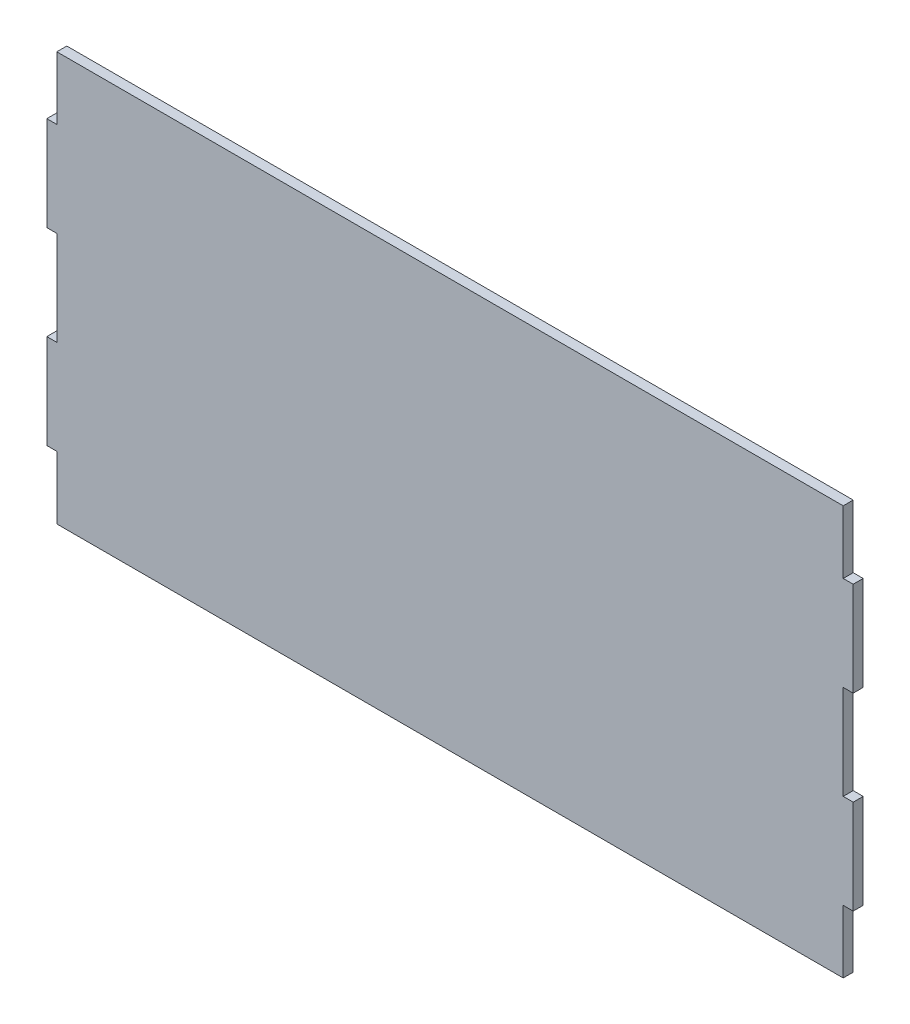
ISO-10303-21;
HEADER;
FILE_DESCRIPTION(('STEP AP214'),'2;1');
FILE_NAME('part.step','',(''),(''),'','','');
FILE_SCHEMA(('AUTOMOTIVE_DESIGN { 1 0 10303 214 1 1 1 1 }'));
ENDSEC;
DATA;
#1=APPLICATION_CONTEXT('core data for automotive mechanical design processes');
#2=APPLICATION_PROTOCOL_DEFINITION('international standard','automotive_design',2000,#1);
#3=PRODUCT_CONTEXT('',#1,'mechanical');
#4=PRODUCT('Part','Part','',(#3));
#5=PRODUCT_RELATED_PRODUCT_CATEGORY('part','',(#4));
#6=PRODUCT_DEFINITION_FORMATION('','',#4);
#7=PRODUCT_DEFINITION_CONTEXT('part definition',#1,'design');
#8=PRODUCT_DEFINITION('design','',#6,#7);
#9=PRODUCT_DEFINITION_SHAPE('','',#8);
#10=(LENGTH_UNIT() NAMED_UNIT(*) SI_UNIT(.MILLI.,.METRE.));
#11=(NAMED_UNIT(*) PLANE_ANGLE_UNIT() SI_UNIT($,.RADIAN.));
#12=(NAMED_UNIT(*) SI_UNIT($,.STERADIAN.) SOLID_ANGLE_UNIT());
#13=UNCERTAINTY_MEASURE_WITH_UNIT(LENGTH_MEASURE(1.E-05),#10,'distance_accuracy_value','');
#14=(GEOMETRIC_REPRESENTATION_CONTEXT(3) GLOBAL_UNCERTAINTY_ASSIGNED_CONTEXT((#13)) GLOBAL_UNIT_ASSIGNED_CONTEXT((#10,
#11,#12)) REPRESENTATION_CONTEXT('',''));
#15=CARTESIAN_POINT('',(0.,0.,0.));
#16=DIRECTION('',(0.,0.,1.));
#17=DIRECTION('',(1.,0.,0.));
#18=AXIS2_PLACEMENT_3D('',#15,#16,#17);
#19=CARTESIAN_POINT('',(250.,0.,3.175));
#20=DIRECTION('',(-1.,0.,0.));
#21=DIRECTION('',(0.,-1.,0.));
#22=AXIS2_PLACEMENT_3D('',#19,#20,#21);
#23=PLANE('',#22);
#24=DIRECTION('',(0.,1.,0.));
#25=VECTOR('',#24,1.);
#26=CARTESIAN_POINT('',(250.,0.,3.175));
#27=LINE('',#26,#25);
#28=CARTESIAN_POINT('',(250.,-80.,3.175));
#29=VERTEX_POINT('',#28);
#30=CARTESIAN_POINT('',(250.,-50.,3.175));
#31=VERTEX_POINT('',#30);
#32=EDGE_CURVE('E36',#29,#31,#27,.T.);
#33=ORIENTED_EDGE('',*,*,#32,.F.);
#34=DIRECTION('',(0.,0.,1.));
#35=VECTOR('',#34,1.);
#36=CARTESIAN_POINT('',(250.,-80.,-30.1675425747607));
#37=LINE('',#36,#35);
#38=CARTESIAN_POINT('',(250.,-80.,0.));
#39=VERTEX_POINT('',#38);
#40=EDGE_CURVE('E203',#39,#29,#37,.T.);
#41=ORIENTED_EDGE('',*,*,#40,.F.);
#42=DIRECTION('',(0.,1.,0.));
#43=VECTOR('',#42,1.);
#44=CARTESIAN_POINT('',(250.,0.,0.));
#45=LINE('',#44,#43);
#46=CARTESIAN_POINT('',(250.,-50.,0.));
#47=VERTEX_POINT('',#46);
#48=EDGE_CURVE('E335',#39,#47,#45,.T.);
#49=ORIENTED_EDGE('',*,*,#48,.T.);
#50=DIRECTION('',(0.,0.,1.));
#51=VECTOR('',#50,1.);
#52=CARTESIAN_POINT('',(250.,-50.,-30.1675425747607));
#53=LINE('',#52,#51);
#54=EDGE_CURVE('E255',#47,#31,#53,.T.);
#55=ORIENTED_EDGE('',*,*,#54,.T.);
#56=EDGE_LOOP('',(#33,#41,#49,#55));
#57=FACE_BOUND('',#56,.T.);
#58=ADVANCED_FACE('F32',(#57),#23,.F.);
#59=CARTESIAN_POINT('',(0.,0.,3.175));
#60=DIRECTION('',(1.,0.,0.));
#61=DIRECTION('',(0.,1.,0.));
#62=AXIS2_PLACEMENT_3D('',#59,#60,#61);
#63=PLANE('',#62);
#64=DIRECTION('',(0.,-1.,0.));
#65=VECTOR('',#64,1.);
#66=CARTESIAN_POINT('',(0.,0.,3.175));
#67=LINE('',#66,#65);
#68=CARTESIAN_POINT('',(0.,-110.,3.175));
#69=VERTEX_POINT('',#68);
#70=CARTESIAN_POINT('',(0.,-130.,3.175));
#71=VERTEX_POINT('',#70);
#72=EDGE_CURVE('E333',#69,#71,#67,.T.);
#73=ORIENTED_EDGE('',*,*,#72,.F.);
#74=DIRECTION('',(0.,0.,1.));
#75=VECTOR('',#74,1.);
#76=CARTESIAN_POINT('',(0.,-110.,-30.1675425747607));
#77=LINE('',#76,#75);
#78=CARTESIAN_POINT('',(0.,-110.,0.));
#79=VERTEX_POINT('',#78);
#80=EDGE_CURVE('E213',#79,#69,#77,.T.);
#81=ORIENTED_EDGE('',*,*,#80,.F.);
#82=DIRECTION('',(0.,-1.,0.));
#83=VECTOR('',#82,1.);
#84=CARTESIAN_POINT('',(0.,0.,0.));
#85=LINE('',#84,#83);
#86=CARTESIAN_POINT('',(0.,-130.,0.));
#87=VERTEX_POINT('',#86);
#88=EDGE_CURVE('E303',#79,#87,#85,.T.);
#89=ORIENTED_EDGE('',*,*,#88,.T.);
#90=DIRECTION('',(0.,0.,-1.));
#91=VECTOR('',#90,1.);
#92=CARTESIAN_POINT('',(0.,-130.,3.175));
#93=LINE('',#92,#91);
#94=EDGE_CURVE('E11',#71,#87,#93,.T.);
#95=ORIENTED_EDGE('',*,*,#94,.F.);
#96=EDGE_LOOP('',(#73,#81,#89,#95));
#97=FACE_BOUND('',#96,.T.);
#98=ADVANCED_FACE('F402',(#97),#63,.F.);
#99=DIRECTION('',(0.,0.,1.));
#100=VECTOR('',#99,1.);
#101=CARTESIAN_POINT('',(250.,-20.,-30.1675425747607));
#102=LINE('',#101,#100);
#103=CARTESIAN_POINT('',(250.,-20.,0.));
#104=VERTEX_POINT('',#103);
#105=CARTESIAN_POINT('',(250.,-20.,3.175));
#106=VERTEX_POINT('',#105);
#107=EDGE_CURVE('E238',#104,#106,#102,.T.);
#108=ORIENTED_EDGE('',*,*,#107,.F.);
#109=CARTESIAN_POINT('',(250.,0.,0.));
#110=VERTEX_POINT('',#109);
#111=EDGE_CURVE('E337',#104,#110,#45,.T.);
#112=ORIENTED_EDGE('',*,*,#111,.T.);
#113=DIRECTION('',(0.,0.,-1.));
#114=VECTOR('',#113,1.);
#115=CARTESIAN_POINT('',(250.,0.,3.175));
#116=LINE('',#115,#114);
#117=CARTESIAN_POINT('',(250.,0.,3.175));
#118=VERTEX_POINT('',#117);
#119=EDGE_CURVE('E358',#118,#110,#116,.T.);
#120=ORIENTED_EDGE('',*,*,#119,.F.);
#121=EDGE_CURVE('E251',#106,#118,#27,.T.);
#122=ORIENTED_EDGE('',*,*,#121,.F.);
#123=EDGE_LOOP('',(#108,#112,#120,#122));
#124=FACE_BOUND('',#123,.T.);
#125=ADVANCED_FACE('F370',(#124),#23,.F.);
#126=CARTESIAN_POINT('',(0.,-50.,0.));
#127=VERTEX_POINT('',#126);
#128=CARTESIAN_POINT('',(0.,-80.,0.));
#129=VERTEX_POINT('',#128);
#130=EDGE_CURVE('E319',#127,#129,#85,.T.);
#131=ORIENTED_EDGE('',*,*,#130,.T.);
#132=DIRECTION('',(0.,0.,1.));
#133=VECTOR('',#132,1.);
#134=CARTESIAN_POINT('',(0.,-80.,-30.1675425747607));
#135=LINE('',#134,#133);
#136=CARTESIAN_POINT('',(0.,-80.,3.175));
#137=VERTEX_POINT('',#136);
#138=EDGE_CURVE('E224',#129,#137,#135,.T.);
#139=ORIENTED_EDGE('',*,*,#138,.T.);
#140=CARTESIAN_POINT('',(0.,-50.,3.175));
#141=VERTEX_POINT('',#140);
#142=EDGE_CURVE('E289',#141,#137,#67,.T.);
#143=ORIENTED_EDGE('',*,*,#142,.F.);
#144=DIRECTION('',(0.,0.,1.));
#145=VECTOR('',#144,1.);
#146=CARTESIAN_POINT('',(0.,-50.,-30.1675425747607));
#147=LINE('',#146,#145);
#148=EDGE_CURVE('E276',#127,#141,#147,.T.);
#149=ORIENTED_EDGE('',*,*,#148,.F.);
#150=EDGE_LOOP('',(#131,#139,#143,#149));
#151=FACE_BOUND('',#150,.T.);
#152=ADVANCED_FACE('F409',(#151),#63,.F.);
#153=CARTESIAN_POINT('',(0.,0.,0.));
#154=VERTEX_POINT('',#153);
#155=CARTESIAN_POINT('',(0.,-20.,0.));
#156=VERTEX_POINT('',#155);
#157=EDGE_CURVE('E322',#154,#156,#85,.T.);
#158=ORIENTED_EDGE('',*,*,#157,.T.);
#159=DIRECTION('',(0.,0.,1.));
#160=VECTOR('',#159,1.);
#161=CARTESIAN_POINT('',(0.,-20.,-30.1675425747607));
#162=LINE('',#161,#160);
#163=CARTESIAN_POINT('',(0.,-20.,3.175));
#164=VERTEX_POINT('',#163);
#165=EDGE_CURVE('E294',#156,#164,#162,.T.);
#166=ORIENTED_EDGE('',*,*,#165,.T.);
#167=CARTESIAN_POINT('',(0.,0.,3.175));
#168=VERTEX_POINT('',#167);
#169=EDGE_CURVE('E317',#168,#164,#67,.T.);
#170=ORIENTED_EDGE('',*,*,#169,.F.);
#171=DIRECTION('',(0.,0.,-1.));
#172=VECTOR('',#171,1.);
#173=CARTESIAN_POINT('',(0.,0.,3.175));
#174=LINE('',#173,#172);
#175=EDGE_CURVE('E355',#168,#154,#174,.T.);
#176=ORIENTED_EDGE('',*,*,#175,.T.);
#177=EDGE_LOOP('',(#158,#166,#170,#176));
#178=FACE_BOUND('',#177,.T.);
#179=ADVANCED_FACE('F34',(#178),#63,.F.);
#180=CARTESIAN_POINT('',(0.,-130.,3.175));
#181=DIRECTION('',(0.,1.,0.));
#182=DIRECTION('',(0.,0.,1.));
#183=AXIS2_PLACEMENT_3D('',#180,#181,#182);
#184=PLANE('',#183);
#185=DIRECTION('',(1.,0.,0.));
#186=VECTOR('',#185,1.);
#187=CARTESIAN_POINT('',(0.,-130.,0.));
#188=LINE('',#187,#186);
#189=CARTESIAN_POINT('',(250.,-130.,0.));
#190=VERTEX_POINT('',#189);
#191=EDGE_CURVE('E327',#87,#190,#188,.T.);
#192=ORIENTED_EDGE('',*,*,#191,.T.);
#193=DIRECTION('',(0.,0.,-1.));
#194=VECTOR('',#193,1.);
#195=CARTESIAN_POINT('',(250.,-130.,3.175));
#196=LINE('',#195,#194);
#197=CARTESIAN_POINT('',(250.,-130.,3.175));
#198=VERTEX_POINT('',#197);
#199=EDGE_CURVE('E42',#198,#190,#196,.T.);
#200=ORIENTED_EDGE('',*,*,#199,.F.);
#201=DIRECTION('',(1.,0.,0.));
#202=VECTOR('',#201,1.);
#203=CARTESIAN_POINT('',(0.,-130.,3.175));
#204=LINE('',#203,#202);
#205=EDGE_CURVE('E313',#71,#198,#204,.T.);
#206=ORIENTED_EDGE('',*,*,#205,.F.);
#207=ORIENTED_EDGE('',*,*,#94,.T.);
#208=EDGE_LOOP('',(#192,#200,#206,#207));
#209=FACE_BOUND('',#208,.T.);
#210=ADVANCED_FACE('F413',(#209),#184,.F.);
#211=CARTESIAN_POINT('',(250.,-110.,0.));
#212=VERTEX_POINT('',#211);
#213=EDGE_CURVE('E336',#190,#212,#45,.T.);
#214=ORIENTED_EDGE('',*,*,#213,.T.);
#215=DIRECTION('',(0.,0.,1.));
#216=VECTOR('',#215,1.);
#217=CARTESIAN_POINT('',(250.,-110.,-30.1675425747607));
#218=LINE('',#217,#216);
#219=CARTESIAN_POINT('',(250.,-110.,3.175));
#220=VERTEX_POINT('',#219);
#221=EDGE_CURVE('E57',#212,#220,#218,.T.);
#222=ORIENTED_EDGE('',*,*,#221,.T.);
#223=EDGE_CURVE('E196',#198,#220,#27,.T.);
#224=ORIENTED_EDGE('',*,*,#223,.F.);
#225=ORIENTED_EDGE('',*,*,#199,.T.);
#226=EDGE_LOOP('',(#214,#222,#224,#225));
#227=FACE_BOUND('',#226,.T.);
#228=ADVANCED_FACE('F404',(#227),#23,.F.);
#229=CARTESIAN_POINT('',(0.,0.,3.175));
#230=DIRECTION('',(0.,-1.,0.));
#231=DIRECTION('',(0.,0.,-1.));
#232=AXIS2_PLACEMENT_3D('',#229,#230,#231);
#233=PLANE('',#232);
#234=DIRECTION('',(-1.,0.,0.));
#235=VECTOR('',#234,1.);
#236=CARTESIAN_POINT('',(0.,0.,0.));
#237=LINE('',#236,#235);
#238=EDGE_CURVE('E334',#110,#154,#237,.T.);
#239=ORIENTED_EDGE('',*,*,#238,.T.);
#240=ORIENTED_EDGE('',*,*,#175,.F.);
#241=DIRECTION('',(-1.,0.,0.));
#242=VECTOR('',#241,1.);
#243=CARTESIAN_POINT('',(0.,0.,3.175));
#244=LINE('',#243,#242);
#245=EDGE_CURVE('E326',#118,#168,#244,.T.);
#246=ORIENTED_EDGE('',*,*,#245,.F.);
#247=ORIENTED_EDGE('',*,*,#119,.T.);
#248=EDGE_LOOP('',(#239,#240,#246,#247));
#249=FACE_BOUND('',#248,.T.);
#250=ADVANCED_FACE('F353',(#249),#233,.F.);
#251=CARTESIAN_POINT('',(0.,0.,3.175));
#252=DIRECTION('',(0.,0.,1.));
#253=DIRECTION('',(1.,0.,0.));
#254=AXIS2_PLACEMENT_3D('',#251,#252,#253);
#255=PLANE('',#254);
#256=ORIENTED_EDGE('',*,*,#169,.T.);
#257=DIRECTION('',(-1.,0.,0.));
#258=VECTOR('',#257,1.);
#259=CARTESIAN_POINT('',(0.,-20.,3.175));
#260=LINE('',#259,#258);
#261=CARTESIAN_POINT('',(-3.175,-20.,3.175));
#262=VERTEX_POINT('',#261);
#263=EDGE_CURVE('E264',#164,#262,#260,.T.);
#264=ORIENTED_EDGE('',*,*,#263,.T.);
#265=DIRECTION('',(0.,-1.,0.));
#266=VECTOR('',#265,1.);
#267=CARTESIAN_POINT('',(-3.175,-20.,3.175));
#268=LINE('',#267,#266);
#269=CARTESIAN_POINT('',(-3.175,-50.,3.175));
#270=VERTEX_POINT('',#269);
#271=EDGE_CURVE('E277',#262,#270,#268,.T.);
#272=ORIENTED_EDGE('',*,*,#271,.T.);
#273=DIRECTION('',(1.,0.,0.));
#274=VECTOR('',#273,1.);
#275=CARTESIAN_POINT('',(0.,-50.,3.175));
#276=LINE('',#275,#274);
#277=EDGE_CURVE('E280',#270,#141,#276,.T.);
#278=ORIENTED_EDGE('',*,*,#277,.T.);
#279=ORIENTED_EDGE('',*,*,#142,.T.);
#280=DIRECTION('',(-1.,0.,0.));
#281=VECTOR('',#280,1.);
#282=CARTESIAN_POINT('',(0.,-80.,3.175));
#283=LINE('',#282,#281);
#284=CARTESIAN_POINT('',(-3.17499999999999,-80.,3.175));
#285=VERTEX_POINT('',#284);
#286=EDGE_CURVE('E209',#137,#285,#283,.T.);
#287=ORIENTED_EDGE('',*,*,#286,.T.);
#288=DIRECTION('',(0.,-1.,0.));
#289=VECTOR('',#288,1.);
#290=CARTESIAN_POINT('',(-3.17499999999999,-80.,3.175));
#291=LINE('',#290,#289);
#292=CARTESIAN_POINT('',(-3.17499999999999,-110.,3.175));
#293=VERTEX_POINT('',#292);
#294=EDGE_CURVE('E218',#285,#293,#291,.T.);
#295=ORIENTED_EDGE('',*,*,#294,.T.);
#296=DIRECTION('',(1.,0.,0.));
#297=VECTOR('',#296,1.);
#298=CARTESIAN_POINT('',(0.,-110.,3.175));
#299=LINE('',#298,#297);
#300=EDGE_CURVE('E221',#293,#69,#299,.T.);
#301=ORIENTED_EDGE('',*,*,#300,.T.);
#302=ORIENTED_EDGE('',*,*,#72,.T.);
#303=ORIENTED_EDGE('',*,*,#205,.T.);
#304=ORIENTED_EDGE('',*,*,#223,.T.);
#305=DIRECTION('',(1.,0.,0.));
#306=VECTOR('',#305,1.);
#307=CARTESIAN_POINT('',(250.,-110.,3.175));
#308=LINE('',#307,#306);
#309=CARTESIAN_POINT('',(253.175,-110.,3.175));
#310=VERTEX_POINT('',#309);
#311=EDGE_CURVE('E178',#220,#310,#308,.T.);
#312=ORIENTED_EDGE('',*,*,#311,.T.);
#313=DIRECTION('',(0.,1.,0.));
#314=VECTOR('',#313,1.);
#315=CARTESIAN_POINT('',(253.175,-80.,3.175));
#316=LINE('',#315,#314);
#317=CARTESIAN_POINT('',(253.175,-80.,3.175));
#318=VERTEX_POINT('',#317);
#319=EDGE_CURVE('E186',#310,#318,#316,.T.);
#320=ORIENTED_EDGE('',*,*,#319,.T.);
#321=DIRECTION('',(-1.,0.,0.));
#322=VECTOR('',#321,1.);
#323=CARTESIAN_POINT('',(250.,-80.,3.175));
#324=LINE('',#323,#322);
#325=EDGE_CURVE('E192',#318,#29,#324,.T.);
#326=ORIENTED_EDGE('',*,*,#325,.T.);
#327=ORIENTED_EDGE('',*,*,#32,.T.);
#328=DIRECTION('',(1.,0.,0.));
#329=VECTOR('',#328,1.);
#330=CARTESIAN_POINT('',(250.,-50.,3.175));
#331=LINE('',#330,#329);
#332=CARTESIAN_POINT('',(253.175,-50.,3.175));
#333=VERTEX_POINT('',#332);
#334=EDGE_CURVE('E234',#31,#333,#331,.T.);
#335=ORIENTED_EDGE('',*,*,#334,.T.);
#336=DIRECTION('',(0.,1.,0.));
#337=VECTOR('',#336,1.);
#338=CARTESIAN_POINT('',(253.175,-20.,3.175));
#339=LINE('',#338,#337);
#340=CARTESIAN_POINT('',(253.175,-20.,3.175));
#341=VERTEX_POINT('',#340);
#342=EDGE_CURVE('E239',#333,#341,#339,.T.);
#343=ORIENTED_EDGE('',*,*,#342,.T.);
#344=DIRECTION('',(-1.,0.,0.));
#345=VECTOR('',#344,1.);
#346=CARTESIAN_POINT('',(250.,-20.,3.175));
#347=LINE('',#346,#345);
#348=EDGE_CURVE('E242',#341,#106,#347,.T.);
#349=ORIENTED_EDGE('',*,*,#348,.T.);
#350=ORIENTED_EDGE('',*,*,#121,.T.);
#351=ORIENTED_EDGE('',*,*,#245,.T.);
#352=EDGE_LOOP('',(#256,#264,#272,#278,#279,#287,#295,#301,#302,#303,#304,#312,#320,#326,#327,
#335,#343,#349,#350,#351));
#353=FACE_BOUND('',#352,.T.);
#354=ADVANCED_FACE('F195',(#353),#255,.T.);
#355=CARTESIAN_POINT('',(0.,0.,0.));
#356=DIRECTION('',(0.,0.,1.));
#357=DIRECTION('',(1.,0.,0.));
#358=AXIS2_PLACEMENT_3D('',#355,#356,#357);
#359=PLANE('',#358);
#360=ORIENTED_EDGE('',*,*,#157,.F.);
#361=ORIENTED_EDGE('',*,*,#238,.F.);
#362=ORIENTED_EDGE('',*,*,#111,.F.);
#363=DIRECTION('',(1.,0.,0.));
#364=VECTOR('',#363,1.);
#365=CARTESIAN_POINT('',(250.,-20.,0.));
#366=LINE('',#365,#364);
#367=CARTESIAN_POINT('',(253.175,-20.,0.));
#368=VERTEX_POINT('',#367);
#369=EDGE_CURVE('E237',#104,#368,#366,.T.);
#370=ORIENTED_EDGE('',*,*,#369,.T.);
#371=DIRECTION('',(0.,-1.,0.));
#372=VECTOR('',#371,1.);
#373=CARTESIAN_POINT('',(253.175,-20.,0.));
#374=LINE('',#373,#372);
#375=CARTESIAN_POINT('',(253.175,-50.,0.));
#376=VERTEX_POINT('',#375);
#377=EDGE_CURVE('E235',#368,#376,#374,.T.);
#378=ORIENTED_EDGE('',*,*,#377,.T.);
#379=DIRECTION('',(-1.,0.,0.));
#380=VECTOR('',#379,1.);
#381=CARTESIAN_POINT('',(250.,-50.,0.));
#382=LINE('',#381,#380);
#383=EDGE_CURVE('E259',#376,#47,#382,.T.);
#384=ORIENTED_EDGE('',*,*,#383,.T.);
#385=ORIENTED_EDGE('',*,*,#48,.F.);
#386=DIRECTION('',(1.,0.,0.));
#387=VECTOR('',#386,1.);
#388=CARTESIAN_POINT('',(250.,-80.,0.));
#389=LINE('',#388,#387);
#390=CARTESIAN_POINT('',(253.175,-80.,0.));
#391=VERTEX_POINT('',#390);
#392=EDGE_CURVE('E199',#39,#391,#389,.T.);
#393=ORIENTED_EDGE('',*,*,#392,.T.);
#394=DIRECTION('',(0.,-1.,0.));
#395=VECTOR('',#394,1.);
#396=CARTESIAN_POINT('',(253.175,-80.,0.));
#397=LINE('',#396,#395);
#398=CARTESIAN_POINT('',(253.175,-110.,0.));
#399=VERTEX_POINT('',#398);
#400=EDGE_CURVE('E205',#391,#399,#397,.T.);
#401=ORIENTED_EDGE('',*,*,#400,.T.);
#402=DIRECTION('',(-1.,0.,0.));
#403=VECTOR('',#402,1.);
#404=CARTESIAN_POINT('',(250.,-110.,0.));
#405=LINE('',#404,#403);
#406=EDGE_CURVE('E180',#399,#212,#405,.T.);
#407=ORIENTED_EDGE('',*,*,#406,.T.);
#408=ORIENTED_EDGE('',*,*,#213,.F.);
#409=ORIENTED_EDGE('',*,*,#191,.F.);
#410=ORIENTED_EDGE('',*,*,#88,.F.);
#411=DIRECTION('',(-1.,0.,0.));
#412=VECTOR('',#411,1.);
#413=CARTESIAN_POINT('',(0.,-110.,0.));
#414=LINE('',#413,#412);
#415=CARTESIAN_POINT('',(-3.17499999999999,-110.,0.));
#416=VERTEX_POINT('',#415);
#417=EDGE_CURVE('E212',#79,#416,#414,.T.);
#418=ORIENTED_EDGE('',*,*,#417,.T.);
#419=DIRECTION('',(0.,1.,0.));
#420=VECTOR('',#419,1.);
#421=CARTESIAN_POINT('',(-3.17499999999999,-80.,0.));
#422=LINE('',#421,#420);
#423=CARTESIAN_POINT('',(-3.17499999999999,-80.,0.));
#424=VERTEX_POINT('',#423);
#425=EDGE_CURVE('E210',#416,#424,#422,.T.);
#426=ORIENTED_EDGE('',*,*,#425,.T.);
#427=DIRECTION('',(1.,0.,0.));
#428=VECTOR('',#427,1.);
#429=CARTESIAN_POINT('',(0.,-80.,0.));
#430=LINE('',#429,#428);
#431=EDGE_CURVE('E215',#424,#129,#430,.T.);
#432=ORIENTED_EDGE('',*,*,#431,.T.);
#433=ORIENTED_EDGE('',*,*,#130,.F.);
#434=DIRECTION('',(-1.,0.,0.));
#435=VECTOR('',#434,1.);
#436=CARTESIAN_POINT('',(0.,-50.,0.));
#437=LINE('',#436,#435);
#438=CARTESIAN_POINT('',(-3.175,-50.,0.));
#439=VERTEX_POINT('',#438);
#440=EDGE_CURVE('E275',#127,#439,#437,.T.);
#441=ORIENTED_EDGE('',*,*,#440,.T.);
#442=DIRECTION('',(0.,1.,0.));
#443=VECTOR('',#442,1.);
#444=CARTESIAN_POINT('',(-3.175,-20.,0.));
#445=LINE('',#444,#443);
#446=CARTESIAN_POINT('',(-3.175,-20.,0.));
#447=VERTEX_POINT('',#446);
#448=EDGE_CURVE('E273',#439,#447,#445,.T.);
#449=ORIENTED_EDGE('',*,*,#448,.T.);
#450=DIRECTION('',(1.,0.,0.));
#451=VECTOR('',#450,1.);
#452=CARTESIAN_POINT('',(0.,-20.,0.));
#453=LINE('',#452,#451);
#454=EDGE_CURVE('E298',#447,#156,#453,.T.);
#455=ORIENTED_EDGE('',*,*,#454,.T.);
#456=EDGE_LOOP('',(#360,#361,#362,#370,#378,#384,#385,#393,#401,#407,#408,#409,#410,#418,#426,
#432,#433,#441,#449,#455));
#457=FACE_BOUND('',#456,.T.);
#458=ADVANCED_FACE('F363',(#457),#359,.F.);
#459=CARTESIAN_POINT('',(0.,-50.,-30.1675425747607));
#460=DIRECTION('',(0.,-1.,0.));
#461=DIRECTION('',(0.,0.,-1.));
#462=AXIS2_PLACEMENT_3D('',#459,#460,#461);
#463=PLANE('',#462);
#464=ORIENTED_EDGE('',*,*,#440,.F.);
#465=ORIENTED_EDGE('',*,*,#148,.T.);
#466=ORIENTED_EDGE('',*,*,#277,.F.);
#467=DIRECTION('',(0.,0.,1.));
#468=VECTOR('',#467,1.);
#469=CARTESIAN_POINT('',(-3.175,-50.,-30.1675425747607));
#470=LINE('',#469,#468);
#471=EDGE_CURVE('E283',#439,#270,#470,.T.);
#472=ORIENTED_EDGE('',*,*,#471,.F.);
#473=EDGE_LOOP('',(#464,#465,#466,#472));
#474=FACE_BOUND('',#473,.T.);
#475=ADVANCED_FACE('F439',(#474),#463,.T.);
#476=CARTESIAN_POINT('',(-3.175,-20.,-30.1675425747607));
#477=DIRECTION('',(-1.,0.,0.));
#478=DIRECTION('',(0.,-1.,0.));
#479=AXIS2_PLACEMENT_3D('',#476,#477,#478);
#480=PLANE('',#479);
#481=ORIENTED_EDGE('',*,*,#448,.F.);
#482=ORIENTED_EDGE('',*,*,#471,.T.);
#483=ORIENTED_EDGE('',*,*,#271,.F.);
#484=DIRECTION('',(0.,0.,1.));
#485=VECTOR('',#484,1.);
#486=CARTESIAN_POINT('',(-3.175,-20.,-30.1675425747607));
#487=LINE('',#486,#485);
#488=EDGE_CURVE('E308',#447,#262,#487,.T.);
#489=ORIENTED_EDGE('',*,*,#488,.F.);
#490=EDGE_LOOP('',(#481,#482,#483,#489));
#491=FACE_BOUND('',#490,.T.);
#492=ADVANCED_FACE('F444',(#491),#480,.T.);
#493=CARTESIAN_POINT('',(0.,-20.,-30.1675425747607));
#494=DIRECTION('',(0.,1.,0.));
#495=DIRECTION('',(-1.,0.,0.));
#496=AXIS2_PLACEMENT_3D('',#493,#494,#495);
#497=PLANE('',#496);
#498=ORIENTED_EDGE('',*,*,#454,.F.);
#499=ORIENTED_EDGE('',*,*,#488,.T.);
#500=ORIENTED_EDGE('',*,*,#263,.F.);
#501=ORIENTED_EDGE('',*,*,#165,.F.);
#502=EDGE_LOOP('',(#498,#499,#500,#501));
#503=FACE_BOUND('',#502,.T.);
#504=ADVANCED_FACE('F449',(#503),#497,.T.);
#505=CARTESIAN_POINT('',(250.,-20.,-30.1675425747607));
#506=DIRECTION('',(0.,1.,0.));
#507=DIRECTION('',(0.,0.,1.));
#508=AXIS2_PLACEMENT_3D('',#505,#506,#507);
#509=PLANE('',#508);
#510=ORIENTED_EDGE('',*,*,#369,.F.);
#511=ORIENTED_EDGE('',*,*,#107,.T.);
#512=ORIENTED_EDGE('',*,*,#348,.F.);
#513=DIRECTION('',(0.,0.,1.));
#514=VECTOR('',#513,1.);
#515=CARTESIAN_POINT('',(253.175,-20.,-30.1675425747607));
#516=LINE('',#515,#514);
#517=EDGE_CURVE('E245',#368,#341,#516,.T.);
#518=ORIENTED_EDGE('',*,*,#517,.F.);
#519=EDGE_LOOP('',(#510,#511,#512,#518));
#520=FACE_BOUND('',#519,.T.);
#521=ADVANCED_FACE('F375',(#520),#509,.T.);
#522=CARTESIAN_POINT('',(253.175,-20.,-30.1675425747607));
#523=DIRECTION('',(1.,0.,0.));
#524=DIRECTION('',(0.,0.,-1.));
#525=AXIS2_PLACEMENT_3D('',#522,#523,#524);
#526=PLANE('',#525);
#527=ORIENTED_EDGE('',*,*,#377,.F.);
#528=ORIENTED_EDGE('',*,*,#517,.T.);
#529=ORIENTED_EDGE('',*,*,#342,.F.);
#530=DIRECTION('',(0.,0.,1.));
#531=VECTOR('',#530,1.);
#532=CARTESIAN_POINT('',(253.175,-50.,-30.1675425747607));
#533=LINE('',#532,#531);
#534=EDGE_CURVE('E269',#376,#333,#533,.T.);
#535=ORIENTED_EDGE('',*,*,#534,.F.);
#536=EDGE_LOOP('',(#527,#528,#529,#535));
#537=FACE_BOUND('',#536,.T.);
#538=ADVANCED_FACE('F386',(#537),#526,.T.);
#539=CARTESIAN_POINT('',(250.,-50.,-30.1675425747607));
#540=DIRECTION('',(0.,-1.,0.));
#541=DIRECTION('',(0.,0.,-1.));
#542=AXIS2_PLACEMENT_3D('',#539,#540,#541);
#543=PLANE('',#542);
#544=ORIENTED_EDGE('',*,*,#383,.F.);
#545=ORIENTED_EDGE('',*,*,#534,.T.);
#546=ORIENTED_EDGE('',*,*,#334,.F.);
#547=ORIENTED_EDGE('',*,*,#54,.F.);
#548=EDGE_LOOP('',(#544,#545,#546,#547));
#549=FACE_BOUND('',#548,.T.);
#550=ADVANCED_FACE('F383',(#549),#543,.T.);
#551=CARTESIAN_POINT('',(0.,-110.,-30.1675425747607));
#552=DIRECTION('',(0.,-1.,0.));
#553=DIRECTION('',(1.,0.,0.));
#554=AXIS2_PLACEMENT_3D('',#551,#552,#553);
#555=PLANE('',#554);
#556=ORIENTED_EDGE('',*,*,#417,.F.);
#557=ORIENTED_EDGE('',*,*,#80,.T.);
#558=ORIENTED_EDGE('',*,*,#300,.F.);
#559=DIRECTION('',(0.,0.,1.));
#560=VECTOR('',#559,1.);
#561=CARTESIAN_POINT('',(-3.17499999999999,-110.,-30.1675425747607));
#562=LINE('',#561,#560);
#563=EDGE_CURVE('E227',#416,#293,#562,.T.);
#564=ORIENTED_EDGE('',*,*,#563,.F.);
#565=EDGE_LOOP('',(#556,#557,#558,#564));
#566=FACE_BOUND('',#565,.T.);
#567=ADVANCED_FACE('F461',(#566),#555,.T.);
#568=CARTESIAN_POINT('',(-3.17499999999999,-80.,-30.1675425747607));
#569=DIRECTION('',(-1.,0.,0.));
#570=DIRECTION('',(0.,-1.,0.));
#571=AXIS2_PLACEMENT_3D('',#568,#569,#570);
#572=PLANE('',#571);
#573=ORIENTED_EDGE('',*,*,#425,.F.);
#574=ORIENTED_EDGE('',*,*,#563,.T.);
#575=ORIENTED_EDGE('',*,*,#294,.F.);
#576=DIRECTION('',(0.,0.,1.));
#577=VECTOR('',#576,1.);
#578=CARTESIAN_POINT('',(-3.17499999999999,-80.,-30.1675425747607));
#579=LINE('',#578,#577);
#580=EDGE_CURVE('E229',#424,#285,#579,.T.);
#581=ORIENTED_EDGE('',*,*,#580,.F.);
#582=EDGE_LOOP('',(#573,#574,#575,#581));
#583=FACE_BOUND('',#582,.T.);
#584=ADVANCED_FACE('F398',(#583),#572,.T.);
#585=CARTESIAN_POINT('',(0.,-80.,-30.1675425747607));
#586=DIRECTION('',(0.,1.,0.));
#587=DIRECTION('',(-1.,0.,0.));
#588=AXIS2_PLACEMENT_3D('',#585,#586,#587);
#589=PLANE('',#588);
#590=ORIENTED_EDGE('',*,*,#431,.F.);
#591=ORIENTED_EDGE('',*,*,#580,.T.);
#592=ORIENTED_EDGE('',*,*,#286,.F.);
#593=ORIENTED_EDGE('',*,*,#138,.F.);
#594=EDGE_LOOP('',(#590,#591,#592,#593));
#595=FACE_BOUND('',#594,.T.);
#596=ADVANCED_FACE('F391',(#595),#589,.T.);
#597=CARTESIAN_POINT('',(250.,-80.,-30.1675425747607));
#598=DIRECTION('',(0.,1.,0.));
#599=DIRECTION('',(-1.,0.,0.));
#600=AXIS2_PLACEMENT_3D('',#597,#598,#599);
#601=PLANE('',#600);
#602=ORIENTED_EDGE('',*,*,#392,.F.);
#603=ORIENTED_EDGE('',*,*,#40,.T.);
#604=ORIENTED_EDGE('',*,*,#325,.F.);
#605=DIRECTION('',(0.,0.,1.));
#606=VECTOR('',#605,1.);
#607=CARTESIAN_POINT('',(253.175,-80.,-30.1675425747607));
#608=LINE('',#607,#606);
#609=EDGE_CURVE('E183',#391,#318,#608,.T.);
#610=ORIENTED_EDGE('',*,*,#609,.F.);
#611=EDGE_LOOP('',(#602,#603,#604,#610));
#612=FACE_BOUND('',#611,.T.);
#613=ADVANCED_FACE('F389',(#612),#601,.T.);
#614=CARTESIAN_POINT('',(253.175,-80.,-30.1675425747607));
#615=DIRECTION('',(1.,0.,0.));
#616=DIRECTION('',(0.,0.,-1.));
#617=AXIS2_PLACEMENT_3D('',#614,#615,#616);
#618=PLANE('',#617);
#619=ORIENTED_EDGE('',*,*,#400,.F.);
#620=ORIENTED_EDGE('',*,*,#609,.T.);
#621=ORIENTED_EDGE('',*,*,#319,.F.);
#622=DIRECTION('',(0.,0.,1.));
#623=VECTOR('',#622,1.);
#624=CARTESIAN_POINT('',(253.175,-110.,-30.1675425747607));
#625=LINE('',#624,#623);
#626=EDGE_CURVE('E174',#399,#310,#625,.T.);
#627=ORIENTED_EDGE('',*,*,#626,.F.);
#628=EDGE_LOOP('',(#619,#620,#621,#627));
#629=FACE_BOUND('',#628,.T.);
#630=ADVANCED_FACE('F187',(#629),#618,.T.);
#631=CARTESIAN_POINT('',(250.,-110.,-30.1675425747607));
#632=DIRECTION('',(0.,-1.,0.));
#633=DIRECTION('',(0.,0.,-1.));
#634=AXIS2_PLACEMENT_3D('',#631,#632,#633);
#635=PLANE('',#634);
#636=ORIENTED_EDGE('',*,*,#406,.F.);
#637=ORIENTED_EDGE('',*,*,#626,.T.);
#638=ORIENTED_EDGE('',*,*,#311,.F.);
#639=ORIENTED_EDGE('',*,*,#221,.F.);
#640=EDGE_LOOP('',(#636,#637,#638,#639));
#641=FACE_BOUND('',#640,.T.);
#642=ADVANCED_FACE('F176',(#641),#635,.T.);
#643=CLOSED_SHELL('',(#58,#98,#125,#152,#179,#210,#228,#250,#354,#458,#475,#492,#504,#521,#538,
#550,#567,#584,#596,#613,#630,#642));
#644=MANIFOLD_SOLID_BREP('B2',#643);
#645=ADVANCED_BREP_SHAPE_REPRESENTATION('',(#18,#644),#14);
#646=SHAPE_DEFINITION_REPRESENTATION(#9,#645);
ENDSEC;
END-ISO-10303-21;
